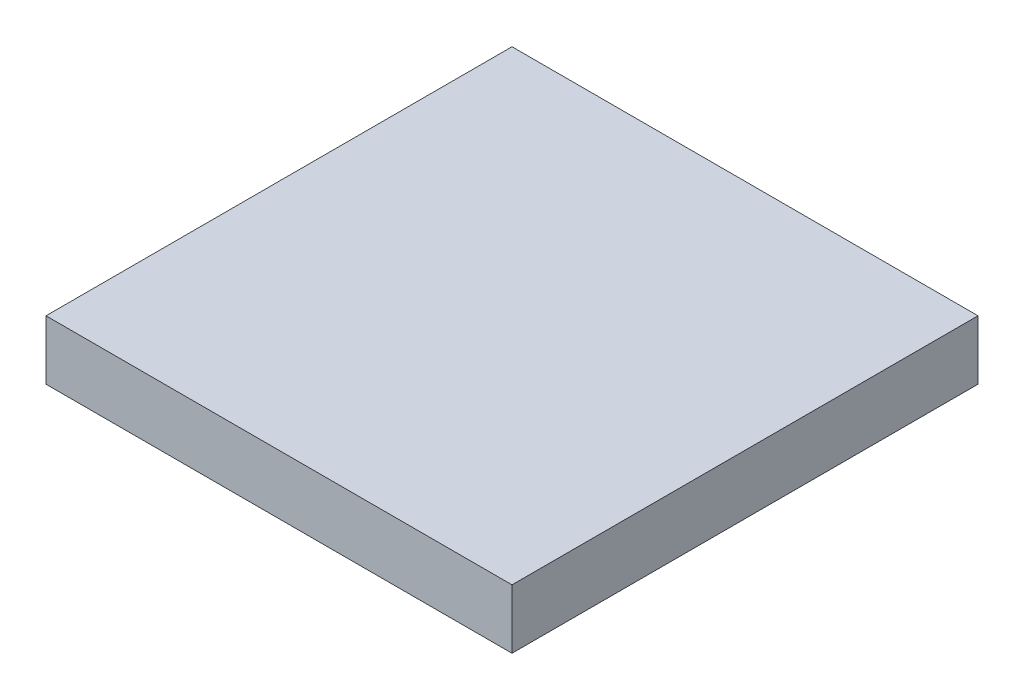
ISO-10303-21;
HEADER;
FILE_DESCRIPTION(('STEP AP214'),'2;1');
FILE_NAME('part.step','',(''),(''),'','','');
FILE_SCHEMA(('AUTOMOTIVE_DESIGN { 1 0 10303 214 1 1 1 1 }'));
ENDSEC;
DATA;
#1=APPLICATION_CONTEXT('core data for automotive mechanical design processes');
#2=APPLICATION_PROTOCOL_DEFINITION('international standard','automotive_design',2000,#1);
#3=PRODUCT_CONTEXT('',#1,'mechanical');
#4=PRODUCT('Part','Part','',(#3));
#5=PRODUCT_RELATED_PRODUCT_CATEGORY('part','',(#4));
#6=PRODUCT_DEFINITION_FORMATION('','',#4);
#7=PRODUCT_DEFINITION_CONTEXT('part definition',#1,'design');
#8=PRODUCT_DEFINITION('design','',#6,#7);
#9=PRODUCT_DEFINITION_SHAPE('','',#8);
#10=(LENGTH_UNIT() NAMED_UNIT(*) SI_UNIT(.MILLI.,.METRE.));
#11=(NAMED_UNIT(*) PLANE_ANGLE_UNIT() SI_UNIT($,.RADIAN.));
#12=(NAMED_UNIT(*) SI_UNIT($,.STERADIAN.) SOLID_ANGLE_UNIT());
#13=UNCERTAINTY_MEASURE_WITH_UNIT(LENGTH_MEASURE(1.E-05),#10,'distance_accuracy_value','');
#14=(GEOMETRIC_REPRESENTATION_CONTEXT(3) GLOBAL_UNCERTAINTY_ASSIGNED_CONTEXT((#13)) GLOBAL_UNIT_ASSIGNED_CONTEXT((#10,
#11,#12)) REPRESENTATION_CONTEXT('',''));
#15=CARTESIAN_POINT('',(0.,0.,0.));
#16=DIRECTION('',(0.,0.,1.));
#17=DIRECTION('',(1.,0.,0.));
#18=AXIS2_PLACEMENT_3D('',#15,#16,#17);
#19=CARTESIAN_POINT('',(0.,6.36,0.));
#20=DIRECTION('',(1.,0.,0.));
#21=DIRECTION('',(0.,0.,-1.));
#22=AXIS2_PLACEMENT_3D('',#19,#20,#21);
#23=PLANE('',#22);
#24=DIRECTION('',(0.,0.,1.));
#25=VECTOR('',#24,1.);
#26=CARTESIAN_POINT('',(0.,0.,0.));
#27=LINE('',#26,#25);
#28=CARTESIAN_POINT('',(0.,0.,-50.));
#29=VERTEX_POINT('',#28);
#30=CARTESIAN_POINT('',(0.,0.,0.));
#31=VERTEX_POINT('',#30);
#32=EDGE_CURVE('E99',#29,#31,#27,.T.);
#33=ORIENTED_EDGE('',*,*,#32,.T.);
#34=DIRECTION('',(0.,-1.,0.));
#35=VECTOR('',#34,1.);
#36=CARTESIAN_POINT('',(0.,6.36,0.));
#37=LINE('',#36,#35);
#38=CARTESIAN_POINT('',(0.,6.36,0.));
#39=VERTEX_POINT('',#38);
#40=EDGE_CURVE('E11',#39,#31,#37,.T.);
#41=ORIENTED_EDGE('',*,*,#40,.F.);
#42=DIRECTION('',(0.,0.,1.));
#43=VECTOR('',#42,1.);
#44=CARTESIAN_POINT('',(0.,6.36,0.));
#45=LINE('',#44,#43);
#46=CARTESIAN_POINT('',(0.,6.36,-50.));
#47=VERTEX_POINT('',#46);
#48=EDGE_CURVE('E87',#47,#39,#45,.T.);
#49=ORIENTED_EDGE('',*,*,#48,.F.);
#50=DIRECTION('',(0.,-1.,0.));
#51=VECTOR('',#50,1.);
#52=CARTESIAN_POINT('',(0.,6.36,-50.));
#53=LINE('',#52,#51);
#54=EDGE_CURVE('E95',#47,#29,#53,.T.);
#55=ORIENTED_EDGE('',*,*,#54,.T.);
#56=EDGE_LOOP('',(#33,#41,#49,#55));
#57=FACE_BOUND('',#56,.T.);
#58=ADVANCED_FACE('F36',(#57),#23,.F.);
#59=CARTESIAN_POINT('',(0.,6.36,0.));
#60=DIRECTION('',(0.,0.,-1.));
#61=DIRECTION('',(-1.,0.,0.));
#62=AXIS2_PLACEMENT_3D('',#59,#60,#61);
#63=PLANE('',#62);
#64=DIRECTION('',(1.,0.,0.));
#65=VECTOR('',#64,1.);
#66=CARTESIAN_POINT('',(0.,0.,0.));
#67=LINE('',#66,#65);
#68=CARTESIAN_POINT('',(50.,0.,0.));
#69=VERTEX_POINT('',#68);
#70=EDGE_CURVE('E91',#31,#69,#67,.T.);
#71=ORIENTED_EDGE('',*,*,#70,.T.);
#72=DIRECTION('',(0.,-1.,0.));
#73=VECTOR('',#72,1.);
#74=CARTESIAN_POINT('',(50.,6.36,0.));
#75=LINE('',#74,#73);
#76=CARTESIAN_POINT('',(50.,6.36,0.));
#77=VERTEX_POINT('',#76);
#78=EDGE_CURVE('E44',#77,#69,#75,.T.);
#79=ORIENTED_EDGE('',*,*,#78,.F.);
#80=DIRECTION('',(1.,0.,0.));
#81=VECTOR('',#80,1.);
#82=CARTESIAN_POINT('',(0.,6.36,0.));
#83=LINE('',#82,#81);
#84=EDGE_CURVE('E82',#39,#77,#83,.T.);
#85=ORIENTED_EDGE('',*,*,#84,.F.);
#86=ORIENTED_EDGE('',*,*,#40,.T.);
#87=EDGE_LOOP('',(#71,#79,#85,#86));
#88=FACE_BOUND('',#87,.T.);
#89=ADVANCED_FACE('F90',(#88),#63,.F.);
#90=CARTESIAN_POINT('',(50.,6.36,0.));
#91=DIRECTION('',(-1.,0.,0.));
#92=DIRECTION('',(0.,0.,1.));
#93=AXIS2_PLACEMENT_3D('',#90,#91,#92);
#94=PLANE('',#93);
#95=DIRECTION('',(0.,0.,-1.));
#96=VECTOR('',#95,1.);
#97=CARTESIAN_POINT('',(50.,0.,0.));
#98=LINE('',#97,#96);
#99=CARTESIAN_POINT('',(50.,0.,-50.));
#100=VERTEX_POINT('',#99);
#101=EDGE_CURVE('E69',#69,#100,#98,.T.);
#102=ORIENTED_EDGE('',*,*,#101,.T.);
#103=DIRECTION('',(0.,-1.,0.));
#104=VECTOR('',#103,1.);
#105=CARTESIAN_POINT('',(50.,6.36,-50.));
#106=LINE('',#105,#104);
#107=CARTESIAN_POINT('',(50.,6.36,-50.));
#108=VERTEX_POINT('',#107);
#109=EDGE_CURVE('E92',#108,#100,#106,.T.);
#110=ORIENTED_EDGE('',*,*,#109,.F.);
#111=DIRECTION('',(0.,0.,-1.));
#112=VECTOR('',#111,1.);
#113=CARTESIAN_POINT('',(50.,6.36,0.));
#114=LINE('',#113,#112);
#115=EDGE_CURVE('E85',#77,#108,#114,.T.);
#116=ORIENTED_EDGE('',*,*,#115,.F.);
#117=ORIENTED_EDGE('',*,*,#78,.T.);
#118=EDGE_LOOP('',(#102,#110,#116,#117));
#119=FACE_BOUND('',#118,.T.);
#120=ADVANCED_FACE('F93',(#119),#94,.F.);
#121=CARTESIAN_POINT('',(0.,6.36,-50.));
#122=DIRECTION('',(0.,0.,1.));
#123=DIRECTION('',(1.,0.,0.));
#124=AXIS2_PLACEMENT_3D('',#121,#122,#123);
#125=PLANE('',#124);
#126=DIRECTION('',(-1.,0.,0.));
#127=VECTOR('',#126,1.);
#128=CARTESIAN_POINT('',(0.,0.,-50.));
#129=LINE('',#128,#127);
#130=EDGE_CURVE('E75',#100,#29,#129,.T.);
#131=ORIENTED_EDGE('',*,*,#130,.T.);
#132=ORIENTED_EDGE('',*,*,#54,.F.);
#133=DIRECTION('',(-1.,0.,0.));
#134=VECTOR('',#133,1.);
#135=CARTESIAN_POINT('',(0.,6.36,-50.));
#136=LINE('',#135,#134);
#137=EDGE_CURVE('E52',#108,#47,#136,.T.);
#138=ORIENTED_EDGE('',*,*,#137,.F.);
#139=ORIENTED_EDGE('',*,*,#109,.T.);
#140=EDGE_LOOP('',(#131,#132,#138,#139));
#141=FACE_BOUND('',#140,.T.);
#142=ADVANCED_FACE('F106',(#141),#125,.F.);
#143=CARTESIAN_POINT('',(0.,6.36,0.));
#144=DIRECTION('',(0.,-1.,0.));
#145=DIRECTION('',(0.,0.,-1.));
#146=AXIS2_PLACEMENT_3D('',#143,#144,#145);
#147=PLANE('',#146);
#148=ORIENTED_EDGE('',*,*,#48,.T.);
#149=ORIENTED_EDGE('',*,*,#84,.T.);
#150=ORIENTED_EDGE('',*,*,#115,.T.);
#151=ORIENTED_EDGE('',*,*,#137,.T.);
#152=EDGE_LOOP('',(#148,#149,#150,#151));
#153=FACE_BOUND('',#152,.T.);
#154=ADVANCED_FACE('F83',(#153),#147,.F.);
#155=CARTESIAN_POINT('',(0.,0.,0.));
#156=DIRECTION('',(0.,-1.,0.));
#157=DIRECTION('',(0.,0.,-1.));
#158=AXIS2_PLACEMENT_3D('',#155,#156,#157);
#159=PLANE('',#158);
#160=ORIENTED_EDGE('',*,*,#32,.F.);
#161=ORIENTED_EDGE('',*,*,#130,.F.);
#162=ORIENTED_EDGE('',*,*,#101,.F.);
#163=ORIENTED_EDGE('',*,*,#70,.F.);
#164=EDGE_LOOP('',(#160,#161,#162,#163));
#165=FACE_BOUND('',#164,.T.);
#166=ADVANCED_FACE('F109',(#165),#159,.T.);
#167=CLOSED_SHELL('',(#58,#89,#120,#142,#154,#166));
#168=MANIFOLD_SOLID_BREP('B2',#167);
#169=ADVANCED_BREP_SHAPE_REPRESENTATION('',(#18,#168),#14);
#170=SHAPE_DEFINITION_REPRESENTATION(#9,#169);
ENDSEC;
END-ISO-10303-21;
